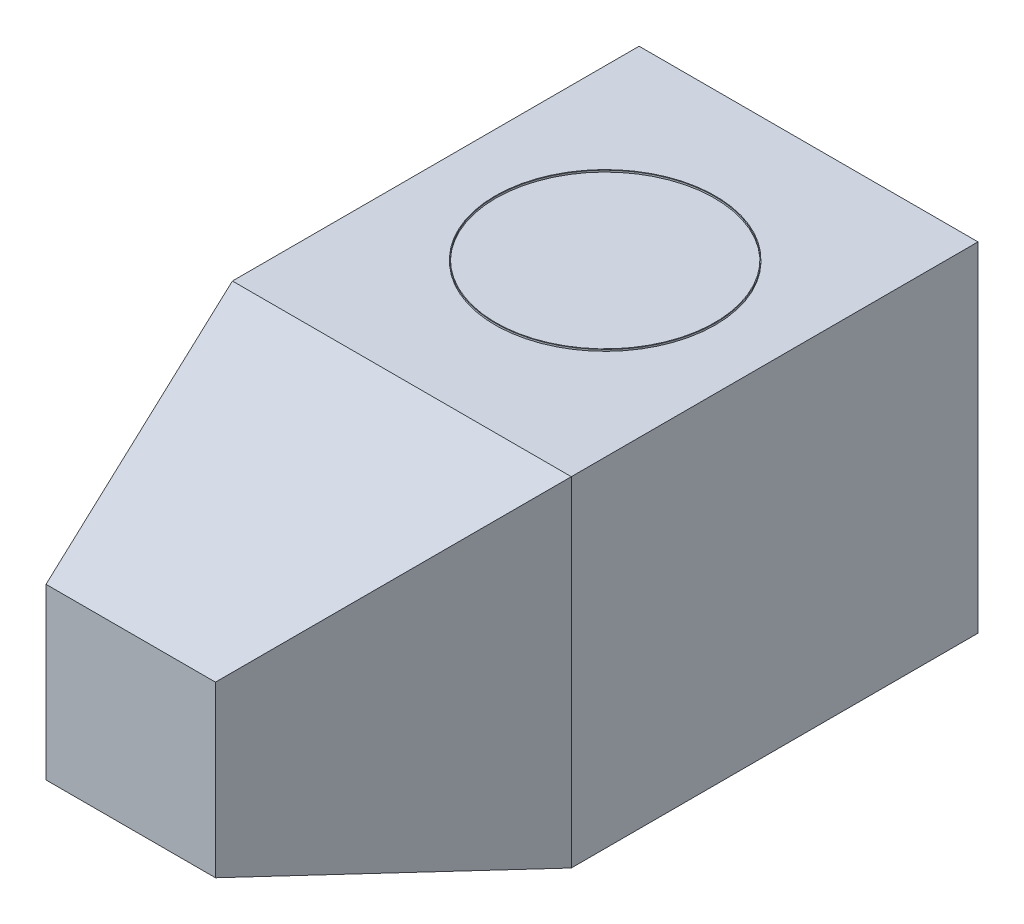
ISO-10303-21;
HEADER;
FILE_DESCRIPTION(('STEP AP214'),'2;1');
FILE_NAME('part.step','',(''),(''),'','','');
FILE_SCHEMA(('AUTOMOTIVE_DESIGN { 1 0 10303 214 1 1 1 1 }'));
ENDSEC;
DATA;
#1=APPLICATION_CONTEXT('core data for automotive mechanical design processes');
#2=APPLICATION_PROTOCOL_DEFINITION('international standard','automotive_design',2000,#1);
#3=PRODUCT_CONTEXT('',#1,'mechanical');
#4=PRODUCT('Part','Part','',(#3));
#5=PRODUCT_RELATED_PRODUCT_CATEGORY('part','',(#4));
#6=PRODUCT_DEFINITION_FORMATION('','',#4);
#7=PRODUCT_DEFINITION_CONTEXT('part definition',#1,'design');
#8=PRODUCT_DEFINITION('design','',#6,#7);
#9=PRODUCT_DEFINITION_SHAPE('','',#8);
#10=(LENGTH_UNIT() NAMED_UNIT(*) SI_UNIT(.MILLI.,.METRE.));
#11=(NAMED_UNIT(*) PLANE_ANGLE_UNIT() SI_UNIT($,.RADIAN.));
#12=(NAMED_UNIT(*) SI_UNIT($,.STERADIAN.) SOLID_ANGLE_UNIT());
#13=UNCERTAINTY_MEASURE_WITH_UNIT(LENGTH_MEASURE(1.E-05),#10,'distance_accuracy_value','');
#14=(GEOMETRIC_REPRESENTATION_CONTEXT(3) GLOBAL_UNCERTAINTY_ASSIGNED_CONTEXT((#13)) GLOBAL_UNIT_ASSIGNED_CONTEXT((#10,
#11,#12)) REPRESENTATION_CONTEXT('',''));
#15=CARTESIAN_POINT('',(0.,0.,0.));
#16=DIRECTION('',(0.,0.,1.));
#17=DIRECTION('',(1.,0.,0.));
#18=AXIS2_PLACEMENT_3D('',#15,#16,#17);
#19=CARTESIAN_POINT('',(5000.,-5000.,12000.));
#20=DIRECTION('',(-1.,0.,0.));
#21=DIRECTION('',(0.,0.,1.));
#22=AXIS2_PLACEMENT_3D('',#19,#20,#21);
#23=PLANE('',#22);
#24=DIRECTION('',(0.,1.,0.));
#25=VECTOR('',#24,1.);
#26=CARTESIAN_POINT('',(5000.,-5000.,0.));
#27=LINE('',#26,#25);
#28=CARTESIAN_POINT('',(5000.,-5000.,0.));
#29=VERTEX_POINT('',#28);
#30=CARTESIAN_POINT('',(5000.,5000.,0.));
#31=VERTEX_POINT('',#30);
#32=EDGE_CURVE('E311',#29,#31,#27,.T.);
#33=ORIENTED_EDGE('',*,*,#32,.T.);
#34=DIRECTION('',(0.,0.,-1.));
#35=VECTOR('',#34,1.);
#36=CARTESIAN_POINT('',(5000.,5000.,12000.));
#37=LINE('',#36,#35);
#38=CARTESIAN_POINT('',(5000.,5000.,12000.));
#39=VERTEX_POINT('',#38);
#40=EDGE_CURVE('E66',#39,#31,#37,.T.);
#41=ORIENTED_EDGE('',*,*,#40,.F.);
#42=DIRECTION('',(0.,1.,0.));
#43=VECTOR('',#42,1.);
#44=CARTESIAN_POINT('',(5000.,0.,12000.));
#45=LINE('',#44,#43);
#46=CARTESIAN_POINT('',(5000.,-5000.,12000.));
#47=VERTEX_POINT('',#46);
#48=EDGE_CURVE('E347',#47,#39,#45,.T.);
#49=ORIENTED_EDGE('',*,*,#48,.F.);
#50=DIRECTION('',(0.,0.,-1.));
#51=VECTOR('',#50,1.);
#52=CARTESIAN_POINT('',(5000.,-5000.,12000.));
#53=LINE('',#52,#51);
#54=EDGE_CURVE('E81',#47,#29,#53,.T.);
#55=ORIENTED_EDGE('',*,*,#54,.T.);
#56=EDGE_LOOP('',(#33,#41,#49,#55));
#57=FACE_BOUND('',#56,.T.);
#58=ADVANCED_FACE('F58',(#57),#23,.F.);
#59=CARTESIAN_POINT('',(-5000.,-5000.,12000.));
#60=DIRECTION('',(0.,1.,0.));
#61=DIRECTION('',(0.,0.,1.));
#62=AXIS2_PLACEMENT_3D('',#59,#60,#61);
#63=PLANE('',#62);
#64=DIRECTION('',(1.,0.,0.));
#65=VECTOR('',#64,1.);
#66=CARTESIAN_POINT('',(-5000.,-5000.,0.));
#67=LINE('',#66,#65);
#68=CARTESIAN_POINT('',(-5000.,-5000.,0.));
#69=VERTEX_POINT('',#68);
#70=EDGE_CURVE('E344',#69,#29,#67,.T.);
#71=ORIENTED_EDGE('',*,*,#70,.T.);
#72=ORIENTED_EDGE('',*,*,#54,.F.);
#73=DIRECTION('',(1.,0.,0.));
#74=VECTOR('',#73,1.);
#75=CARTESIAN_POINT('',(0.,-5000.,12000.));
#76=LINE('',#75,#74);
#77=CARTESIAN_POINT('',(-5000.,-5000.,12000.));
#78=VERTEX_POINT('',#77);
#79=EDGE_CURVE('E352',#78,#47,#76,.T.);
#80=ORIENTED_EDGE('',*,*,#79,.F.);
#81=DIRECTION('',(0.,0.,-1.));
#82=VECTOR('',#81,1.);
#83=CARTESIAN_POINT('',(-5000.,-5000.,12000.));
#84=LINE('',#83,#82);
#85=EDGE_CURVE('E345',#78,#69,#84,.T.);
#86=ORIENTED_EDGE('',*,*,#85,.T.);
#87=EDGE_LOOP('',(#71,#72,#80,#86));
#88=FACE_BOUND('',#87,.T.);
#89=ADVANCED_FACE('F335',(#88),#63,.F.);
#90=CARTESIAN_POINT('',(0.,0.,0.));
#91=DIRECTION('',(0.,0.,-1.));
#92=DIRECTION('',(-1.,0.,0.));
#93=AXIS2_PLACEMENT_3D('',#90,#91,#92);
#94=PLANE('',#93);
#95=ORIENTED_EDGE('',*,*,#70,.F.);
#96=DIRECTION('',(0.,1.,0.));
#97=VECTOR('',#96,1.);
#98=CARTESIAN_POINT('',(-5000.,-5000.,0.));
#99=LINE('',#98,#97);
#100=CARTESIAN_POINT('',(-5000.,5000.,0.));
#101=VERTEX_POINT('',#100);
#102=EDGE_CURVE('E425',#69,#101,#99,.T.);
#103=ORIENTED_EDGE('',*,*,#102,.T.);
#104=DIRECTION('',(1.,0.,0.));
#105=VECTOR('',#104,1.);
#106=CARTESIAN_POINT('',(-5000.,5000.,0.));
#107=LINE('',#106,#105);
#108=EDGE_CURVE('E356',#101,#31,#107,.T.);
#109=ORIENTED_EDGE('',*,*,#108,.T.);
#110=ORIENTED_EDGE('',*,*,#32,.F.);
#111=EDGE_LOOP('',(#95,#103,#109,#110));
#112=FACE_BOUND('',#111,.T.);
#113=CARTESIAN_POINT('',(0.,0.,0.));
#114=DIRECTION('',(0.,0.,-1.));
#115=DIRECTION('',(-1.,0.,0.));
#116=AXIS2_PLACEMENT_3D('',#113,#114,#115);
#117=CIRCLE('',#116,590.);
#118=CARTESIAN_POINT('',(-590.,0.,0.));
#119=VERTEX_POINT('',#118);
#120=EDGE_CURVE('E410',#119,#119,#117,.T.);
#121=ORIENTED_EDGE('',*,*,#120,.F.);
#122=EDGE_LOOP('',(#121));
#123=FACE_BOUND('',#122,.T.);
#124=ADVANCED_FACE('F265',(#112,#123),#94,.T.);
#125=CARTESIAN_POINT('',(0.,0.,20000.));
#126=DIRECTION('',(0.,0.,-1.));
#127=DIRECTION('',(-1.,0.,0.));
#128=AXIS2_PLACEMENT_3D('',#125,#126,#127);
#129=PLANE('',#128);
#130=DIRECTION('',(0.,1.,0.));
#131=VECTOR('',#130,1.);
#132=CARTESIAN_POINT('',(2500.,-2500.,20000.));
#133=LINE('',#132,#131);
#134=CARTESIAN_POINT('',(2500.,-2500.,20000.));
#135=VERTEX_POINT('',#134);
#136=CARTESIAN_POINT('',(2500.,2500.,20000.));
#137=VERTEX_POINT('',#136);
#138=EDGE_CURVE('E318',#135,#137,#133,.T.);
#139=ORIENTED_EDGE('',*,*,#138,.T.);
#140=CARTESIAN_POINT('',(-2500.,2500.,20000.));
#141=DIRECTION('',(1.,0.,0.));
#142=VECTOR('',#141,1.);
#143=LINE('',#140,#142);
#144=CARTESIAN_POINT('',(-2500.,2500.,20000.));
#145=VERTEX_POINT('',#144);
#146=EDGE_CURVE('E180',#145,#137,#143,.T.);
#147=ORIENTED_EDGE('',*,*,#146,.F.);
#148=CARTESIAN_POINT('',(-2500.,-2500.,20000.));
#149=DIRECTION('',(0.,1.,0.));
#150=VECTOR('',#149,1.);
#151=LINE('',#148,#150);
#152=CARTESIAN_POINT('',(-2500.,-2500.,20000.));
#153=VERTEX_POINT('',#152);
#154=EDGE_CURVE('E196',#153,#145,#151,.T.);
#155=ORIENTED_EDGE('',*,*,#154,.F.);
#156=DIRECTION('',(1.,0.,0.));
#157=VECTOR('',#156,1.);
#158=CARTESIAN_POINT('',(-2500.,-2500.,20000.));
#159=LINE('',#158,#157);
#160=EDGE_CURVE('E302',#153,#135,#159,.T.);
#161=ORIENTED_EDGE('',*,*,#160,.T.);
#162=EDGE_LOOP('',(#139,#147,#155,#161));
#163=FACE_BOUND('',#162,.T.);
#164=ADVANCED_FACE('F260',(#163),#129,.F.);
#165=CARTESIAN_POINT('',(7971.53024911032,0.,2491.10320284698));
#166=DIRECTION('',(0.95447997803503,0.,0.298274993135947));
#167=DIRECTION('',(0.298274993135947,0.,-0.95447997803503));
#168=AXIS2_PLACEMENT_3D('',#165,#166,#167);
#169=PLANE('',#168);
#170=DIRECTION('',(0.285830975237515,-0.285830975237515,-0.914659120760047));
#171=VECTOR('',#170,1.);
#172=CARTESIAN_POINT('',(2500.,-2500.,20000.));
#173=LINE('',#172,#171);
#174=EDGE_CURVE('E317',#135,#47,#173,.T.);
#175=ORIENTED_EDGE('',*,*,#174,.T.);
#176=ORIENTED_EDGE('',*,*,#48,.T.);
#177=DIRECTION('',(0.285830975237515,0.285830975237515,-0.914659120760047));
#178=VECTOR('',#177,1.);
#179=CARTESIAN_POINT('',(2500.,2500.,20000.));
#180=LINE('',#179,#178);
#181=EDGE_CURVE('E312',#137,#39,#180,.T.);
#182=ORIENTED_EDGE('',*,*,#181,.F.);
#183=ORIENTED_EDGE('',*,*,#138,.F.);
#184=EDGE_LOOP('',(#175,#176,#182,#183));
#185=FACE_BOUND('',#184,.T.);
#186=ADVANCED_FACE('F264',(#185),#169,.T.);
#187=CARTESIAN_POINT('',(0.,-7971.53024911032,2491.10320284698));
#188=DIRECTION('',(0.,-0.95447997803503,0.298274993135947));
#189=DIRECTION('',(0.,-0.298274993135947,-0.95447997803503));
#190=AXIS2_PLACEMENT_3D('',#187,#188,#189);
#191=PLANE('',#190);
#192=DIRECTION('',(-0.285830975237515,-0.285830975237515,-0.914659120760047));
#193=VECTOR('',#192,1.);
#194=CARTESIAN_POINT('',(-2500.,-2500.,20000.));
#195=LINE('',#194,#193);
#196=EDGE_CURVE('E305',#153,#78,#195,.T.);
#197=ORIENTED_EDGE('',*,*,#196,.T.);
#198=ORIENTED_EDGE('',*,*,#79,.T.);
#199=ORIENTED_EDGE('',*,*,#174,.F.);
#200=ORIENTED_EDGE('',*,*,#160,.F.);
#201=EDGE_LOOP('',(#197,#198,#199,#200));
#202=FACE_BOUND('',#201,.T.);
#203=ADVANCED_FACE('F234',(#202),#191,.T.);
#204=CARTESIAN_POINT('',(0.,0.,-500.));
#205=DIRECTION('',(0.,0.,1.));
#206=DIRECTION('',(1.,0.,0.));
#207=AXIS2_PLACEMENT_3D('',#204,#205,#206);
#208=CYLINDRICAL_SURFACE('',#207,590.);
#209=CARTESIAN_POINT('',(0.,0.,-500.));
#210=DIRECTION('',(0.,0.,-1.));
#211=DIRECTION('',(-1.,0.,0.));
#212=AXIS2_PLACEMENT_3D('',#209,#210,#211);
#213=CIRCLE('',#212,590.);
#214=CARTESIAN_POINT('',(-590.,0.,-500.));
#215=VERTEX_POINT('',#214);
#216=EDGE_CURVE('E407',#215,#215,#213,.T.);
#217=ORIENTED_EDGE('',*,*,#216,.F.);
#218=EDGE_LOOP('',(#217));
#219=FACE_BOUND('',#218,.T.);
#220=ORIENTED_EDGE('',*,*,#120,.T.);
#221=EDGE_LOOP('',(#220));
#222=FACE_BOUND('',#221,.T.);
#223=ADVANCED_FACE('F230',(#219,#222),#208,.T.);
#224=CARTESIAN_POINT('',(0.,0.,-500.));
#225=DIRECTION('',(0.,0.,-1.));
#226=DIRECTION('',(-1.,0.,0.));
#227=AXIS2_PLACEMENT_3D('',#224,#225,#226);
#228=PLANE('',#227);
#229=ORIENTED_EDGE('',*,*,#216,.T.);
#230=EDGE_LOOP('',(#229));
#231=FACE_BOUND('',#230,.T.);
#232=ADVANCED_FACE('F215',(#231),#228,.T.);
#233=CARTESIAN_POINT('',(-7971.53024911032,-1.77003528481164E-12,2491.10320284698));
#234=DIRECTION('',(-0.95447997803503,0.,0.298274993135947));
#235=DIRECTION('',(-0.298274993135947,0.,-0.95447997803503));
#236=AXIS2_PLACEMENT_3D('',#233,#234,#235);
#237=PLANE('',#236);
#238=ORIENTED_EDGE('',*,*,#196,.F.);
#239=ORIENTED_EDGE('',*,*,#154,.T.);
#240=DIRECTION('',(-0.285830975237515,0.285830975237515,-0.914659120760047));
#241=VECTOR('',#240,1.);
#242=CARTESIAN_POINT('',(-2500.,2500.,20000.));
#243=LINE('',#242,#241);
#244=CARTESIAN_POINT('',(-5000.,5000.,12000.));
#245=VERTEX_POINT('',#244);
#246=EDGE_CURVE('E202',#145,#245,#243,.T.);
#247=ORIENTED_EDGE('',*,*,#246,.T.);
#248=DIRECTION('',(0.,1.,0.));
#249=VECTOR('',#248,1.);
#250=CARTESIAN_POINT('',(-5000.,-1.11022302462516E-12,12000.));
#251=LINE('',#250,#249);
#252=EDGE_CURVE('E307',#78,#245,#251,.T.);
#253=ORIENTED_EDGE('',*,*,#252,.F.);
#254=EDGE_LOOP('',(#238,#239,#247,#253));
#255=FACE_BOUND('',#254,.T.);
#256=ADVANCED_FACE('F204',(#255),#237,.T.);
#257=CARTESIAN_POINT('',(-3.54007056962327E-12,7971.53024911032,2491.10320284698));
#258=DIRECTION('',(0.,0.95447997803503,0.298274993135947));
#259=DIRECTION('',(0.,0.298274993135947,-0.95447997803503));
#260=AXIS2_PLACEMENT_3D('',#257,#258,#259);
#261=PLANE('',#260);
#262=ORIENTED_EDGE('',*,*,#246,.F.);
#263=ORIENTED_EDGE('',*,*,#146,.T.);
#264=ORIENTED_EDGE('',*,*,#181,.T.);
#265=DIRECTION('',(1.,0.,0.));
#266=VECTOR('',#265,1.);
#267=CARTESIAN_POINT('',(-2.22044604925031E-12,5000.,12000.));
#268=LINE('',#267,#266);
#269=EDGE_CURVE('E417',#245,#39,#268,.T.);
#270=ORIENTED_EDGE('',*,*,#269,.F.);
#271=EDGE_LOOP('',(#262,#263,#264,#270));
#272=FACE_BOUND('',#271,.T.);
#273=ADVANCED_FACE('F214',(#272),#261,.T.);
#274=CARTESIAN_POINT('',(-5000.,-5000.,12000.));
#275=DIRECTION('',(1.,0.,0.));
#276=DIRECTION('',(0.,0.,1.));
#277=AXIS2_PLACEMENT_3D('',#274,#275,#276);
#278=PLANE('',#277);
#279=ORIENTED_EDGE('',*,*,#102,.F.);
#280=ORIENTED_EDGE('',*,*,#85,.F.);
#281=ORIENTED_EDGE('',*,*,#252,.T.);
#282=DIRECTION('',(0.,0.,-1.));
#283=VECTOR('',#282,1.);
#284=CARTESIAN_POINT('',(-5000.,5000.,12000.));
#285=LINE('',#284,#283);
#286=EDGE_CURVE('E414',#245,#101,#285,.T.);
#287=ORIENTED_EDGE('',*,*,#286,.T.);
#288=EDGE_LOOP('',(#279,#280,#281,#287));
#289=FACE_BOUND('',#288,.T.);
#290=ADVANCED_FACE('F218',(#289),#278,.F.);
#291=CARTESIAN_POINT('',(-5000.,5000.,12000.));
#292=DIRECTION('',(0.,-1.,0.));
#293=DIRECTION('',(0.,0.,1.));
#294=AXIS2_PLACEMENT_3D('',#291,#292,#293);
#295=PLANE('',#294);
#296=CARTESIAN_POINT('',(-1.33226762955019E-12,5000.,6000.));
#297=DIRECTION('',(0.,-1.,0.));
#298=DIRECTION('',(1.,0.,0.));
#299=AXIS2_PLACEMENT_3D('',#296,#297,#298);
#300=CIRCLE('',#299,3250.);
#301=CARTESIAN_POINT('',(3250.,5000.,6000.));
#302=VERTEX_POINT('',#301);
#303=EDGE_CURVE('E12',#302,#302,#300,.F.);
#304=ORIENTED_EDGE('',*,*,#303,.F.);
#305=EDGE_LOOP('',(#304));
#306=FACE_BOUND('',#305,.T.);
#307=ORIENTED_EDGE('',*,*,#108,.F.);
#308=ORIENTED_EDGE('',*,*,#286,.F.);
#309=ORIENTED_EDGE('',*,*,#269,.T.);
#310=ORIENTED_EDGE('',*,*,#40,.T.);
#311=EDGE_LOOP('',(#307,#308,#309,#310));
#312=FACE_BOUND('',#311,.T.);
#313=ADVANCED_FACE('F221',(#306,#312),#295,.F.);
#314=CARTESIAN_POINT('',(-1.35447209004269E-12,5050.,6000.));
#315=DIRECTION('',(0.,-1.,0.));
#316=DIRECTION('',(1.,0.,0.));
#317=AXIS2_PLACEMENT_3D('',#314,#315,#316);
#318=CYLINDRICAL_SURFACE('',#317,3230.);
#319=CARTESIAN_POINT('',(-1.35447209004269E-12,5050.,6000.));
#320=DIRECTION('',(0.,1.,0.));
#321=DIRECTION('',(-1.,0.,0.));
#322=AXIS2_PLACEMENT_3D('',#319,#320,#321);
#323=CIRCLE('',#322,3230.);
#324=CARTESIAN_POINT('',(-3230.,5050.,6000.));
#325=VERTEX_POINT('',#324);
#326=EDGE_CURVE('E634',#325,#325,#323,.T.);
#327=ORIENTED_EDGE('',*,*,#326,.T.);
#328=EDGE_LOOP('',(#327));
#329=FACE_BOUND('',#328,.T.);
#330=CARTESIAN_POINT('',(-1.33226762955019E-12,5000.,6000.));
#331=DIRECTION('',(0.,1.,0.));
#332=DIRECTION('',(-1.,0.,0.));
#333=AXIS2_PLACEMENT_3D('',#330,#331,#332);
#334=CIRCLE('',#333,3230.);
#335=CARTESIAN_POINT('',(-3230.,5000.,6000.));
#336=VERTEX_POINT('',#335);
#337=EDGE_CURVE('E632',#336,#336,#334,.T.);
#338=ORIENTED_EDGE('',*,*,#337,.F.);
#339=EDGE_LOOP('',(#338));
#340=FACE_BOUND('',#339,.T.);
#341=ADVANCED_FACE('F225',(#329,#340),#318,.F.);
#342=CARTESIAN_POINT('',(-1.35447209004269E-12,5050.,6000.));
#343=DIRECTION('',(0.,-1.,0.));
#344=DIRECTION('',(1.,0.,0.));
#345=AXIS2_PLACEMENT_3D('',#342,#343,#344);
#346=CYLINDRICAL_SURFACE('',#345,3250.);
#347=CARTESIAN_POINT('',(-1.35447209004269E-12,5050.,6000.));
#348=DIRECTION('',(0.,1.,0.));
#349=DIRECTION('',(-1.,0.,0.));
#350=AXIS2_PLACEMENT_3D('',#347,#348,#349);
#351=CIRCLE('',#350,3250.);
#352=CARTESIAN_POINT('',(-3250.,5050.,6000.));
#353=VERTEX_POINT('',#352);
#354=EDGE_CURVE('E190',#353,#353,#351,.T.);
#355=ORIENTED_EDGE('',*,*,#354,.F.);
#356=EDGE_LOOP('',(#355));
#357=FACE_BOUND('',#356,.T.);
#358=ORIENTED_EDGE('',*,*,#303,.T.);
#359=EDGE_LOOP('',(#358));
#360=FACE_BOUND('',#359,.T.);
#361=ADVANCED_FACE('F521',(#357,#360),#346,.T.);
#362=CARTESIAN_POINT('',(-2.21523063919207E-12,5050.,0.));
#363=DIRECTION('',(0.,1.,0.));
#364=DIRECTION('',(-1.,0.,0.));
#365=AXIS2_PLACEMENT_3D('',#362,#363,#364);
#366=PLANE('',#365);
#367=ORIENTED_EDGE('',*,*,#326,.F.);
#368=EDGE_LOOP('',(#367));
#369=FACE_BOUND('',#368,.T.);
#370=ORIENTED_EDGE('',*,*,#354,.T.);
#371=EDGE_LOOP('',(#370));
#372=FACE_BOUND('',#371,.T.);
#373=ADVANCED_FACE('F532',(#369,#372),#366,.T.);
#374=ORIENTED_EDGE('',*,*,#337,.T.);
#375=EDGE_LOOP('',(#374));
#376=FACE_BOUND('',#375,.T.);
#377=ADVANCED_FACE('F227',(#376),#295,.F.);
#378=CLOSED_SHELL('',(#58,#89,#124,#164,#186,#203,#223,#232,#256,#273,#290,#313,#341,#361,#373,#377));
#379=CARTESIAN_POINT('',(-5000.,4950.,12000.));
#380=DIRECTION('',(0.,-1.,0.));
#381=DIRECTION('',(0.,0.,1.));
#382=AXIS2_PLACEMENT_3D('',#379,#380,#381);
#383=PLANE('',#382);
#384=DIRECTION('',(1.,0.,0.));
#385=VECTOR('',#384,1.);
#386=CARTESIAN_POINT('',(-2.19824158875781E-12,4950.,50.));
#387=LINE('',#386,#385);
#388=CARTESIAN_POINT('',(-4950.,4950.,50.));
#389=VERTEX_POINT('',#388);
#390=CARTESIAN_POINT('',(4950.,4950.,50.));
#391=VERTEX_POINT('',#390);
#392=EDGE_CURVE('E160',#389,#391,#387,.T.);
#393=ORIENTED_EDGE('',*,*,#392,.T.);
#394=DIRECTION('',(0.,0.,-1.));
#395=VECTOR('',#394,1.);
#396=CARTESIAN_POINT('',(4950.,4950.,12000.));
#397=LINE('',#396,#395);
#398=CARTESIAN_POINT('',(4950.,4950.,11992.3694538576));
#399=VERTEX_POINT('',#398);
#400=EDGE_CURVE('E183',#399,#391,#397,.T.);
#401=ORIENTED_EDGE('',*,*,#400,.F.);
#402=DIRECTION('',(1.,0.,0.));
#403=VECTOR('',#402,1.);
#404=CARTESIAN_POINT('',(-5000.,4950.,11992.3694538576));
#405=LINE('',#404,#403);
#406=CARTESIAN_POINT('',(-4950.,4950.,11992.3694538576));
#407=VERTEX_POINT('',#406);
#408=EDGE_CURVE('E153',#407,#399,#405,.T.);
#409=ORIENTED_EDGE('',*,*,#408,.F.);
#410=DIRECTION('',(0.,0.,-1.));
#411=VECTOR('',#410,1.);
#412=CARTESIAN_POINT('',(-4950.,4950.,12000.));
#413=LINE('',#412,#411);
#414=EDGE_CURVE('E171',#407,#389,#413,.T.);
#415=ORIENTED_EDGE('',*,*,#414,.T.);
#416=EDGE_LOOP('',(#393,#401,#409,#415));
#417=FACE_BOUND('',#416,.T.);
#418=ADVANCED_FACE('F182',(#417),#383,.T.);
#419=CARTESIAN_POINT('',(-4950.,-5000.,12000.));
#420=DIRECTION('',(1.,0.,0.));
#421=DIRECTION('',(0.,0.,1.));
#422=AXIS2_PLACEMENT_3D('',#419,#420,#421);
#423=PLANE('',#422);
#424=DIRECTION('',(0.,1.,0.));
#425=VECTOR('',#424,1.);
#426=CARTESIAN_POINT('',(-4950.,-1.0991207943789E-12,50.));
#427=LINE('',#426,#425);
#428=CARTESIAN_POINT('',(-4950.,-4950.,50.));
#429=VERTEX_POINT('',#428);
#430=EDGE_CURVE('E176',#429,#389,#427,.T.);
#431=ORIENTED_EDGE('',*,*,#430,.T.);
#432=ORIENTED_EDGE('',*,*,#414,.F.);
#433=DIRECTION('',(0.,1.,0.));
#434=VECTOR('',#433,1.);
#435=CARTESIAN_POINT('',(-4950.,-5000.,11992.3694538576));
#436=LINE('',#435,#434);
#437=CARTESIAN_POINT('',(-4950.,-4950.,11992.3694538576));
#438=VERTEX_POINT('',#437);
#439=EDGE_CURVE('E165',#438,#407,#436,.T.);
#440=ORIENTED_EDGE('',*,*,#439,.F.);
#441=DIRECTION('',(0.,0.,-1.));
#442=VECTOR('',#441,1.);
#443=CARTESIAN_POINT('',(-4950.,-4950.,12000.));
#444=LINE('',#443,#442);
#445=EDGE_CURVE('E386',#438,#429,#444,.T.);
#446=ORIENTED_EDGE('',*,*,#445,.T.);
#447=EDGE_LOOP('',(#431,#432,#440,#446));
#448=FACE_BOUND('',#447,.T.);
#449=ADVANCED_FACE('F174',(#448),#423,.T.);
#450=CARTESIAN_POINT('',(-3.51887685666011E-12,7923.80625020857,2476.18945319018));
#451=DIRECTION('',(0.,0.95447997803503,0.298274993135947));
#452=DIRECTION('',(0.,0.298274993135947,-0.95447997803503));
#453=AXIS2_PLACEMENT_3D('',#450,#451,#452);
#454=PLANE('',#453);
#455=DIRECTION('',(-0.285830975237515,0.285830975237515,-0.914659120760047));
#456=VECTOR('',#455,1.);
#457=CARTESIAN_POINT('',(-7276.43645852487,7276.43645852486,4547.77278657804));
#458=LINE('',#457,#456);
#459=CARTESIAN_POINT('',(-2463.2404543305,2463.2404543305,19950.));
#460=VERTEX_POINT('',#459);
#461=EDGE_CURVE('E149',#460,#407,#458,.T.);
#462=ORIENTED_EDGE('',*,*,#461,.T.);
#463=ORIENTED_EDGE('',*,*,#408,.T.);
#464=DIRECTION('',(0.285830975237515,0.285830975237515,-0.914659120760047));
#465=VECTOR('',#464,1.);
#466=CARTESIAN_POINT('',(7276.43645852486,7276.43645852486,4547.77278657804));
#467=LINE('',#466,#465);
#468=CARTESIAN_POINT('',(2463.2404543305,2463.2404543305,19950.));
#469=VERTEX_POINT('',#468);
#470=EDGE_CURVE('E73',#469,#399,#467,.T.);
#471=ORIENTED_EDGE('',*,*,#470,.F.);
#472=DIRECTION('',(1.,0.,0.));
#473=VECTOR('',#472,1.);
#474=CARTESIAN_POINT('',(-1.09389850703434E-12,2463.2404543305,19950.));
#475=LINE('',#474,#473);
#476=EDGE_CURVE('E156',#460,#469,#475,.T.);
#477=ORIENTED_EDGE('',*,*,#476,.F.);
#478=EDGE_LOOP('',(#462,#463,#471,#477));
#479=FACE_BOUND('',#478,.T.);
#480=ADVANCED_FACE('F151',(#479),#454,.F.);
#481=CARTESIAN_POINT('',(-7923.80625020857,-1.75943842833006E-12,2476.18945319018));
#482=DIRECTION('',(-0.95447997803503,0.,0.298274993135947));
#483=DIRECTION('',(-0.298274993135947,0.,-0.95447997803503));
#484=AXIS2_PLACEMENT_3D('',#481,#482,#483);
#485=PLANE('',#484);
#486=DIRECTION('',(-0.285830975237515,-0.285830975237515,-0.914659120760047));
#487=VECTOR('',#486,1.);
#488=CARTESIAN_POINT('',(-3322.18809251179,-3322.18809251179,17201.3675578199));
#489=LINE('',#488,#487);
#490=CARTESIAN_POINT('',(-2463.2404543305,-2463.2404543305,19950.));
#491=VERTEX_POINT('',#490);
#492=EDGE_CURVE('E168',#491,#438,#489,.T.);
#493=ORIENTED_EDGE('',*,*,#492,.T.);
#494=ORIENTED_EDGE('',*,*,#439,.T.);
#495=ORIENTED_EDGE('',*,*,#461,.F.);
#496=DIRECTION('',(0.,1.,0.));
#497=VECTOR('',#496,1.);
#498=CARTESIAN_POINT('',(-2463.2404543305,-5.4694925351717E-13,19950.));
#499=LINE('',#498,#497);
#500=EDGE_CURVE('E161',#491,#460,#499,.T.);
#501=ORIENTED_EDGE('',*,*,#500,.F.);
#502=EDGE_LOOP('',(#493,#494,#495,#501));
#503=FACE_BOUND('',#502,.T.);
#504=ADVANCED_FACE('F167',(#503),#485,.F.);
#505=CARTESIAN_POINT('',(0.,-7923.80625020857,2476.18945319018));
#506=DIRECTION('',(0.,-0.95447997803503,0.298274993135947));
#507=DIRECTION('',(0.,-0.298274993135947,-0.95447997803503));
#508=AXIS2_PLACEMENT_3D('',#505,#506,#507);
#509=PLANE('',#508);
#510=ORIENTED_EDGE('',*,*,#492,.F.);
#511=DIRECTION('',(1.,0.,0.));
#512=VECTOR('',#511,1.);
#513=CARTESIAN_POINT('',(0.,-2463.2404543305,19950.));
#514=LINE('',#513,#512);
#515=CARTESIAN_POINT('',(2463.2404543305,-2463.2404543305,19950.));
#516=VERTEX_POINT('',#515);
#517=EDGE_CURVE('E393',#491,#516,#514,.T.);
#518=ORIENTED_EDGE('',*,*,#517,.T.);
#519=DIRECTION('',(0.285830975237515,-0.285830975237515,-0.914659120760047));
#520=VECTOR('',#519,1.);
#521=CARTESIAN_POINT('',(7276.43645852486,-7276.43645852486,4547.77278657804));
#522=LINE('',#521,#520);
#523=CARTESIAN_POINT('',(4950.,-4950.,11992.3694538576));
#524=VERTEX_POINT('',#523);
#525=EDGE_CURVE('E398',#516,#524,#522,.T.);
#526=ORIENTED_EDGE('',*,*,#525,.T.);
#527=DIRECTION('',(1.,0.,0.));
#528=VECTOR('',#527,1.);
#529=CARTESIAN_POINT('',(-5000.,-4950.,11992.3694538576));
#530=LINE('',#529,#528);
#531=EDGE_CURVE('E405',#438,#524,#530,.T.);
#532=ORIENTED_EDGE('',*,*,#531,.F.);
#533=EDGE_LOOP('',(#510,#518,#526,#532));
#534=FACE_BOUND('',#533,.T.);
#535=ADVANCED_FACE('F256',(#534),#509,.F.);
#536=CARTESIAN_POINT('',(7923.80625020857,0.,2476.18945319018));
#537=DIRECTION('',(0.95447997803503,0.,0.298274993135947));
#538=DIRECTION('',(0.298274993135947,0.,-0.95447997803503));
#539=AXIS2_PLACEMENT_3D('',#536,#537,#538);
#540=PLANE('',#539);
#541=ORIENTED_EDGE('',*,*,#525,.F.);
#542=DIRECTION('',(0.,1.,0.));
#543=VECTOR('',#542,1.);
#544=CARTESIAN_POINT('',(2463.2404543305,0.,19950.));
#545=LINE('',#544,#543);
#546=EDGE_CURVE('E403',#516,#469,#545,.T.);
#547=ORIENTED_EDGE('',*,*,#546,.T.);
#548=ORIENTED_EDGE('',*,*,#470,.T.);
#549=DIRECTION('',(0.,1.,0.));
#550=VECTOR('',#549,1.);
#551=CARTESIAN_POINT('',(4950.,-5000.,11992.3694538576));
#552=LINE('',#551,#550);
#553=EDGE_CURVE('E420',#524,#399,#552,.T.);
#554=ORIENTED_EDGE('',*,*,#553,.F.);
#555=EDGE_LOOP('',(#541,#547,#548,#554));
#556=FACE_BOUND('',#555,.T.);
#557=ADVANCED_FACE('F252',(#556),#540,.F.);
#558=CARTESIAN_POINT('',(0.,0.,19950.));
#559=DIRECTION('',(0.,0.,-1.));
#560=DIRECTION('',(-1.,0.,0.));
#561=AXIS2_PLACEMENT_3D('',#558,#559,#560);
#562=PLANE('',#561);
#563=ORIENTED_EDGE('',*,*,#546,.F.);
#564=ORIENTED_EDGE('',*,*,#517,.F.);
#565=ORIENTED_EDGE('',*,*,#500,.T.);
#566=ORIENTED_EDGE('',*,*,#476,.T.);
#567=EDGE_LOOP('',(#563,#564,#565,#566));
#568=FACE_BOUND('',#567,.T.);
#569=ADVANCED_FACE('F248',(#568),#562,.T.);
#570=CARTESIAN_POINT('',(0.,0.,50.));
#571=DIRECTION('',(0.,0.,-1.));
#572=DIRECTION('',(-1.,0.,0.));
#573=AXIS2_PLACEMENT_3D('',#570,#571,#572);
#574=PLANE('',#573);
#575=DIRECTION('',(0.,1.,0.));
#576=VECTOR('',#575,1.);
#577=CARTESIAN_POINT('',(4950.,0.,50.));
#578=LINE('',#577,#576);
#579=CARTESIAN_POINT('',(4950.,-4950.,50.));
#580=VERTEX_POINT('',#579);
#581=EDGE_CURVE('E395',#580,#391,#578,.T.);
#582=ORIENTED_EDGE('',*,*,#581,.T.);
#583=ORIENTED_EDGE('',*,*,#392,.F.);
#584=ORIENTED_EDGE('',*,*,#430,.F.);
#585=DIRECTION('',(1.,0.,0.));
#586=VECTOR('',#585,1.);
#587=CARTESIAN_POINT('',(0.,-4950.,50.));
#588=LINE('',#587,#586);
#589=EDGE_CURVE('E396',#429,#580,#588,.T.);
#590=ORIENTED_EDGE('',*,*,#589,.T.);
#591=EDGE_LOOP('',(#582,#583,#584,#590));
#592=FACE_BOUND('',#591,.T.);
#593=ADVANCED_FACE('F244',(#592),#574,.F.);
#594=CARTESIAN_POINT('',(-5000.,-4950.,12000.));
#595=DIRECTION('',(0.,1.,0.));
#596=DIRECTION('',(0.,0.,1.));
#597=AXIS2_PLACEMENT_3D('',#594,#595,#596);
#598=PLANE('',#597);
#599=ORIENTED_EDGE('',*,*,#589,.F.);
#600=ORIENTED_EDGE('',*,*,#445,.F.);
#601=ORIENTED_EDGE('',*,*,#531,.T.);
#602=DIRECTION('',(0.,0.,-1.));
#603=VECTOR('',#602,1.);
#604=CARTESIAN_POINT('',(4950.,-4950.,12000.));
#605=LINE('',#604,#603);
#606=EDGE_CURVE('E390',#524,#580,#605,.T.);
#607=ORIENTED_EDGE('',*,*,#606,.T.);
#608=EDGE_LOOP('',(#599,#600,#601,#607));
#609=FACE_BOUND('',#608,.T.);
#610=ADVANCED_FACE('F239',(#609),#598,.T.);
#611=CARTESIAN_POINT('',(4950.,-5000.,12000.));
#612=DIRECTION('',(-1.,0.,0.));
#613=DIRECTION('',(0.,0.,1.));
#614=AXIS2_PLACEMENT_3D('',#611,#612,#613);
#615=PLANE('',#614);
#616=ORIENTED_EDGE('',*,*,#581,.F.);
#617=ORIENTED_EDGE('',*,*,#606,.F.);
#618=ORIENTED_EDGE('',*,*,#553,.T.);
#619=ORIENTED_EDGE('',*,*,#400,.T.);
#620=EDGE_LOOP('',(#616,#617,#618,#619));
#621=FACE_BOUND('',#620,.T.);
#622=ADVANCED_FACE('F236',(#621),#615,.T.);
#623=CLOSED_SHELL('',(#418,#449,#480,#504,#535,#557,#569,#593,#610,#622));
#624=ORIENTED_CLOSED_SHELL('',*,#623,.T.);
#625=BREP_WITH_VOIDS('B2',#378,(#624));
#626=ADVANCED_BREP_SHAPE_REPRESENTATION('',(#18,#625),#14);
#627=SHAPE_DEFINITION_REPRESENTATION(#9,#626);
ENDSEC;
END-ISO-10303-21;
